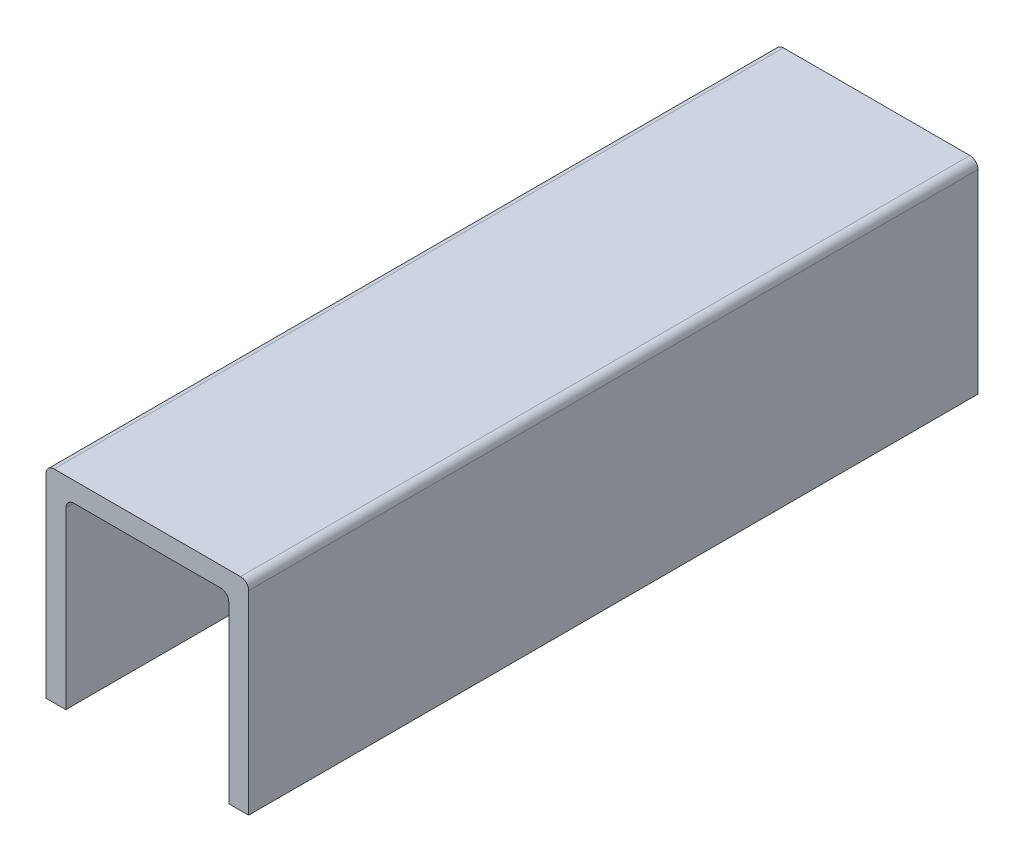
ISO-10303-21;
HEADER;
FILE_DESCRIPTION(('STEP AP214'),'2;1');
FILE_NAME('part.step','',(''),(''),'','','');
FILE_SCHEMA(('AUTOMOTIVE_DESIGN { 1 0 10303 214 1 1 1 1 }'));
ENDSEC;
DATA;
#1=APPLICATION_CONTEXT('core data for automotive mechanical design processes');
#2=APPLICATION_PROTOCOL_DEFINITION('international standard','automotive_design',2000,#1);
#3=PRODUCT_CONTEXT('',#1,'mechanical');
#4=PRODUCT('Part','Part','',(#3));
#5=PRODUCT_RELATED_PRODUCT_CATEGORY('part','',(#4));
#6=PRODUCT_DEFINITION_FORMATION('','',#4);
#7=PRODUCT_DEFINITION_CONTEXT('part definition',#1,'design');
#8=PRODUCT_DEFINITION('design','',#6,#7);
#9=PRODUCT_DEFINITION_SHAPE('','',#8);
#10=(LENGTH_UNIT() NAMED_UNIT(*) SI_UNIT(.MILLI.,.METRE.));
#11=(NAMED_UNIT(*) PLANE_ANGLE_UNIT() SI_UNIT($,.RADIAN.));
#12=(NAMED_UNIT(*) SI_UNIT($,.STERADIAN.) SOLID_ANGLE_UNIT());
#13=UNCERTAINTY_MEASURE_WITH_UNIT(LENGTH_MEASURE(1.E-05),#10,'distance_accuracy_value','');
#14=(GEOMETRIC_REPRESENTATION_CONTEXT(3) GLOBAL_UNCERTAINTY_ASSIGNED_CONTEXT((#13)) GLOBAL_UNIT_ASSIGNED_CONTEXT((#10,
#11,#12)) REPRESENTATION_CONTEXT('',''));
#15=CARTESIAN_POINT('',(0.,0.,0.));
#16=DIRECTION('',(0.,0.,1.));
#17=DIRECTION('',(1.,0.,0.));
#18=AXIS2_PLACEMENT_3D('',#15,#16,#17);
#19=CARTESIAN_POINT('',(4.887,0.,180.));
#20=DIRECTION('',(0.,1.,0.));
#21=DIRECTION('',(-1.,0.,0.));
#22=AXIS2_PLACEMENT_3D('',#19,#20,#21);
#23=PLANE('',#22);
#24=DIRECTION('',(1.,0.,0.));
#25=VECTOR('',#24,1.);
#26=CARTESIAN_POINT('',(4.887,0.,0.));
#27=LINE('',#26,#25);
#28=CARTESIAN_POINT('',(0.,0.,0.));
#29=VERTEX_POINT('',#28);
#30=CARTESIAN_POINT('',(4.887,0.,0.));
#31=VERTEX_POINT('',#30);
#32=EDGE_CURVE('E152',#29,#31,#27,.T.);
#33=ORIENTED_EDGE('',*,*,#32,.T.);
#34=DIRECTION('',(0.,0.,-1.));
#35=VECTOR('',#34,1.);
#36=CARTESIAN_POINT('',(4.887,0.,180.));
#37=LINE('',#36,#35);
#38=CARTESIAN_POINT('',(4.887,0.,180.));
#39=VERTEX_POINT('',#38);
#40=EDGE_CURVE('E133',#39,#31,#37,.T.);
#41=ORIENTED_EDGE('',*,*,#40,.F.);
#42=DIRECTION('',(1.,0.,0.));
#43=VECTOR('',#42,1.);
#44=CARTESIAN_POINT('',(4.887,0.,180.));
#45=LINE('',#44,#43);
#46=CARTESIAN_POINT('',(0.,0.,180.));
#47=VERTEX_POINT('',#46);
#48=EDGE_CURVE('E139',#47,#39,#45,.T.);
#49=ORIENTED_EDGE('',*,*,#48,.F.);
#50=DIRECTION('',(0.,0.,-1.));
#51=VECTOR('',#50,1.);
#52=CARTESIAN_POINT('',(0.,0.,180.));
#53=LINE('',#52,#51);
#54=EDGE_CURVE('E222',#47,#29,#53,.T.);
#55=ORIENTED_EDGE('',*,*,#54,.T.);
#56=EDGE_LOOP('',(#33,#41,#49,#55));
#57=FACE_BOUND('',#56,.T.);
#58=ADVANCED_FACE('F38',(#57),#23,.F.);
#59=CARTESIAN_POINT('',(4.887,45.113,180.));
#60=DIRECTION('',(-1.,0.,0.));
#61=DIRECTION('',(0.,-1.,0.));
#62=AXIS2_PLACEMENT_3D('',#59,#60,#61);
#63=PLANE('',#62);
#64=DIRECTION('',(0.,1.,0.));
#65=VECTOR('',#64,1.);
#66=CARTESIAN_POINT('',(4.887,45.113,0.));
#67=LINE('',#66,#65);
#68=CARTESIAN_POINT('',(4.887,43.113,0.));
#69=VERTEX_POINT('',#68);
#70=EDGE_CURVE('E205',#31,#69,#67,.T.);
#71=ORIENTED_EDGE('',*,*,#70,.T.);
#72=DIRECTION('',(0.,0.,-1.));
#73=VECTOR('',#72,1.);
#74=CARTESIAN_POINT('',(4.887,43.113,180.));
#75=LINE('',#74,#73);
#76=CARTESIAN_POINT('',(4.887,43.113,180.));
#77=VERTEX_POINT('',#76);
#78=EDGE_CURVE('E136',#69,#77,#75,.F.);
#79=ORIENTED_EDGE('',*,*,#78,.T.);
#80=DIRECTION('',(0.,1.,0.));
#81=VECTOR('',#80,1.);
#82=CARTESIAN_POINT('',(4.887,45.113,180.));
#83=LINE('',#82,#81);
#84=EDGE_CURVE('E128',#39,#77,#83,.T.);
#85=ORIENTED_EDGE('',*,*,#84,.F.);
#86=ORIENTED_EDGE('',*,*,#40,.T.);
#87=EDGE_LOOP('',(#71,#79,#85,#86));
#88=FACE_BOUND('',#87,.T.);
#89=ADVANCED_FACE('F131',(#88),#63,.F.);
#90=CARTESIAN_POINT('',(45.113,45.113,180.));
#91=DIRECTION('',(0.,1.,0.));
#92=DIRECTION('',(-1.,0.,0.));
#93=AXIS2_PLACEMENT_3D('',#90,#91,#92);
#94=PLANE('',#93);
#95=DIRECTION('',(1.,0.,0.));
#96=VECTOR('',#95,1.);
#97=CARTESIAN_POINT('',(45.113,45.113,180.));
#98=LINE('',#97,#96);
#99=CARTESIAN_POINT('',(6.88700000000002,45.113,180.));
#100=VERTEX_POINT('',#99);
#101=CARTESIAN_POINT('',(43.113,45.113,180.));
#102=VERTEX_POINT('',#101);
#103=EDGE_CURVE('E138',#100,#102,#98,.T.);
#104=ORIENTED_EDGE('',*,*,#103,.F.);
#105=DIRECTION('',(0.,0.,-1.));
#106=VECTOR('',#105,1.);
#107=CARTESIAN_POINT('',(6.887,45.113,0.));
#108=LINE('',#107,#106);
#109=CARTESIAN_POINT('',(6.88700000000002,45.113,0.));
#110=VERTEX_POINT('',#109);
#111=EDGE_CURVE('E179',#100,#110,#108,.T.);
#112=ORIENTED_EDGE('',*,*,#111,.T.);
#113=DIRECTION('',(1.,0.,0.));
#114=VECTOR('',#113,1.);
#115=CARTESIAN_POINT('',(45.113,45.113,0.));
#116=LINE('',#115,#114);
#117=CARTESIAN_POINT('',(43.113,45.113,0.));
#118=VERTEX_POINT('',#117);
#119=EDGE_CURVE('E195',#110,#118,#116,.T.);
#120=ORIENTED_EDGE('',*,*,#119,.T.);
#121=DIRECTION('',(0.,0.,-1.));
#122=VECTOR('',#121,1.);
#123=CARTESIAN_POINT('',(43.113,45.113,180.));
#124=LINE('',#123,#122);
#125=EDGE_CURVE('E177',#118,#102,#124,.F.);
#126=ORIENTED_EDGE('',*,*,#125,.T.);
#127=EDGE_LOOP('',(#104,#112,#120,#126));
#128=FACE_BOUND('',#127,.T.);
#129=ADVANCED_FACE('F203',(#128),#94,.F.);
#130=CARTESIAN_POINT('',(45.113,0.,180.));
#131=DIRECTION('',(1.,0.,0.));
#132=DIRECTION('',(0.,0.,-1.));
#133=AXIS2_PLACEMENT_3D('',#130,#131,#132);
#134=PLANE('',#133);
#135=DIRECTION('',(0.,-1.,0.));
#136=VECTOR('',#135,1.);
#137=CARTESIAN_POINT('',(45.113,0.,180.));
#138=LINE('',#137,#136);
#139=CARTESIAN_POINT('',(45.113,43.113,180.));
#140=VERTEX_POINT('',#139);
#141=CARTESIAN_POINT('',(45.113,0.,180.));
#142=VERTEX_POINT('',#141);
#143=EDGE_CURVE('E210',#140,#142,#138,.T.);
#144=ORIENTED_EDGE('',*,*,#143,.F.);
#145=DIRECTION('',(0.,0.,-1.));
#146=VECTOR('',#145,1.);
#147=CARTESIAN_POINT('',(45.113,43.113,0.));
#148=LINE('',#147,#146);
#149=CARTESIAN_POINT('',(45.113,43.113,0.));
#150=VERTEX_POINT('',#149);
#151=EDGE_CURVE('E183',#140,#150,#148,.T.);
#152=ORIENTED_EDGE('',*,*,#151,.T.);
#153=DIRECTION('',(0.,-1.,0.));
#154=VECTOR('',#153,1.);
#155=CARTESIAN_POINT('',(45.113,0.,0.));
#156=LINE('',#155,#154);
#157=CARTESIAN_POINT('',(45.113,0.,0.));
#158=VERTEX_POINT('',#157);
#159=EDGE_CURVE('E197',#150,#158,#156,.T.);
#160=ORIENTED_EDGE('',*,*,#159,.T.);
#161=DIRECTION('',(0.,0.,-1.));
#162=VECTOR('',#161,1.);
#163=CARTESIAN_POINT('',(45.113,0.,180.));
#164=LINE('',#163,#162);
#165=EDGE_CURVE('E154',#142,#158,#164,.T.);
#166=ORIENTED_EDGE('',*,*,#165,.F.);
#167=EDGE_LOOP('',(#144,#152,#160,#166));
#168=FACE_BOUND('',#167,.T.);
#169=ADVANCED_FACE('F208',(#168),#134,.F.);
#170=CARTESIAN_POINT('',(50.,0.,180.));
#171=DIRECTION('',(0.,1.,0.));
#172=DIRECTION('',(-1.,0.,0.));
#173=AXIS2_PLACEMENT_3D('',#170,#171,#172);
#174=PLANE('',#173);
#175=DIRECTION('',(1.,0.,0.));
#176=VECTOR('',#175,1.);
#177=CARTESIAN_POINT('',(50.,0.,0.));
#178=LINE('',#177,#176);
#179=CARTESIAN_POINT('',(50.,0.,0.));
#180=VERTEX_POINT('',#179);
#181=EDGE_CURVE('E226',#158,#180,#178,.T.);
#182=ORIENTED_EDGE('',*,*,#181,.T.);
#183=DIRECTION('',(0.,0.,-1.));
#184=VECTOR('',#183,1.);
#185=CARTESIAN_POINT('',(50.,0.,180.));
#186=LINE('',#185,#184);
#187=CARTESIAN_POINT('',(50.,0.,180.));
#188=VERTEX_POINT('',#187);
#189=EDGE_CURVE('E160',#188,#180,#186,.T.);
#190=ORIENTED_EDGE('',*,*,#189,.F.);
#191=DIRECTION('',(1.,0.,0.));
#192=VECTOR('',#191,1.);
#193=CARTESIAN_POINT('',(50.,0.,180.));
#194=LINE('',#193,#192);
#195=EDGE_CURVE('E212',#142,#188,#194,.T.);
#196=ORIENTED_EDGE('',*,*,#195,.F.);
#197=ORIENTED_EDGE('',*,*,#165,.T.);
#198=EDGE_LOOP('',(#182,#190,#196,#197));
#199=FACE_BOUND('',#198,.T.);
#200=ADVANCED_FACE('F286',(#199),#174,.F.);
#201=CARTESIAN_POINT('',(50.,50.,180.));
#202=DIRECTION('',(-1.,0.,0.));
#203=DIRECTION('',(0.,0.,1.));
#204=AXIS2_PLACEMENT_3D('',#201,#202,#203);
#205=PLANE('',#204);
#206=DIRECTION('',(0.,1.,0.));
#207=VECTOR('',#206,1.);
#208=CARTESIAN_POINT('',(50.,50.,0.));
#209=LINE('',#208,#207);
#210=CARTESIAN_POINT('',(50.,48.,0.));
#211=VERTEX_POINT('',#210);
#212=EDGE_CURVE('E228',#180,#211,#209,.T.);
#213=ORIENTED_EDGE('',*,*,#212,.T.);
#214=DIRECTION('',(0.,0.,-1.));
#215=VECTOR('',#214,1.);
#216=CARTESIAN_POINT('',(50.,48.,180.));
#217=LINE('',#216,#215);
#218=CARTESIAN_POINT('',(50.,48.,180.));
#219=VERTEX_POINT('',#218);
#220=EDGE_CURVE('E53',#211,#219,#217,.F.);
#221=ORIENTED_EDGE('',*,*,#220,.T.);
#222=DIRECTION('',(0.,1.,0.));
#223=VECTOR('',#222,1.);
#224=CARTESIAN_POINT('',(50.,50.,180.));
#225=LINE('',#224,#223);
#226=EDGE_CURVE('E214',#188,#219,#225,.T.);
#227=ORIENTED_EDGE('',*,*,#226,.F.);
#228=ORIENTED_EDGE('',*,*,#189,.T.);
#229=EDGE_LOOP('',(#213,#221,#227,#228));
#230=FACE_BOUND('',#229,.T.);
#231=ADVANCED_FACE('F237',(#230),#205,.F.);
#232=CARTESIAN_POINT('',(0.,50.,180.));
#233=DIRECTION('',(0.,-1.,0.));
#234=DIRECTION('',(0.,0.,-1.));
#235=AXIS2_PLACEMENT_3D('',#232,#233,#234);
#236=PLANE('',#235);
#237=DIRECTION('',(-1.,0.,0.));
#238=VECTOR('',#237,1.);
#239=CARTESIAN_POINT('',(0.,50.,0.));
#240=LINE('',#239,#238);
#241=CARTESIAN_POINT('',(48.,50.,0.));
#242=VERTEX_POINT('',#241);
#243=CARTESIAN_POINT('',(2.,50.,0.));
#244=VERTEX_POINT('',#243);
#245=EDGE_CURVE('E230',#242,#244,#240,.T.);
#246=ORIENTED_EDGE('',*,*,#245,.T.);
#247=DIRECTION('',(0.,0.,-1.));
#248=VECTOR('',#247,1.);
#249=CARTESIAN_POINT('',(2.,50.,180.));
#250=LINE('',#249,#248);
#251=CARTESIAN_POINT('',(2.,50.,180.));
#252=VERTEX_POINT('',#251);
#253=EDGE_CURVE('E170',#244,#252,#250,.F.);
#254=ORIENTED_EDGE('',*,*,#253,.T.);
#255=DIRECTION('',(-1.,0.,0.));
#256=VECTOR('',#255,1.);
#257=CARTESIAN_POINT('',(0.,50.,180.));
#258=LINE('',#257,#256);
#259=CARTESIAN_POINT('',(48.,50.,180.));
#260=VERTEX_POINT('',#259);
#261=EDGE_CURVE('E219',#260,#252,#258,.T.);
#262=ORIENTED_EDGE('',*,*,#261,.F.);
#263=DIRECTION('',(0.,0.,-1.));
#264=VECTOR('',#263,1.);
#265=CARTESIAN_POINT('',(48.,50.,180.));
#266=LINE('',#265,#264);
#267=EDGE_CURVE('E167',#260,#242,#266,.T.);
#268=ORIENTED_EDGE('',*,*,#267,.T.);
#269=EDGE_LOOP('',(#246,#254,#262,#268));
#270=FACE_BOUND('',#269,.T.);
#271=ADVANCED_FACE('F246',(#270),#236,.F.);
#272=CARTESIAN_POINT('',(0.,0.,180.));
#273=DIRECTION('',(1.,0.,0.));
#274=DIRECTION('',(0.,0.,-1.));
#275=AXIS2_PLACEMENT_3D('',#272,#273,#274);
#276=PLANE('',#275);
#277=DIRECTION('',(0.,-1.,0.));
#278=VECTOR('',#277,1.);
#279=CARTESIAN_POINT('',(0.,0.,180.));
#280=LINE('',#279,#278);
#281=CARTESIAN_POINT('',(0.,48.,180.));
#282=VERTEX_POINT('',#281);
#283=EDGE_CURVE('E145',#282,#47,#280,.T.);
#284=ORIENTED_EDGE('',*,*,#283,.F.);
#285=DIRECTION('',(0.,0.,-1.));
#286=VECTOR('',#285,1.);
#287=CARTESIAN_POINT('',(0.,48.,180.));
#288=LINE('',#287,#286);
#289=CARTESIAN_POINT('',(0.,48.,0.));
#290=VERTEX_POINT('',#289);
#291=EDGE_CURVE('E153',#282,#290,#288,.T.);
#292=ORIENTED_EDGE('',*,*,#291,.T.);
#293=DIRECTION('',(0.,-1.,0.));
#294=VECTOR('',#293,1.);
#295=CARTESIAN_POINT('',(0.,0.,0.));
#296=LINE('',#295,#294);
#297=EDGE_CURVE('E149',#290,#29,#296,.T.);
#298=ORIENTED_EDGE('',*,*,#297,.T.);
#299=ORIENTED_EDGE('',*,*,#54,.F.);
#300=EDGE_LOOP('',(#284,#292,#298,#299));
#301=FACE_BOUND('',#300,.T.);
#302=ADVANCED_FACE('F253',(#301),#276,.F.);
#303=CARTESIAN_POINT('',(0.,0.,180.));
#304=DIRECTION('',(0.,0.,-1.));
#305=DIRECTION('',(-1.,0.,0.));
#306=AXIS2_PLACEMENT_3D('',#303,#304,#305);
#307=PLANE('',#306);
#308=ORIENTED_EDGE('',*,*,#261,.T.);
#309=CARTESIAN_POINT('',(2.,48.,180.));
#310=DIRECTION('',(0.,0.,-1.));
#311=DIRECTION('',(-1.,0.,0.));
#312=AXIS2_PLACEMENT_3D('',#309,#310,#311);
#313=CIRCLE('',#312,2.);
#314=EDGE_CURVE('E174',#252,#282,#313,.F.);
#315=ORIENTED_EDGE('',*,*,#314,.T.);
#316=ORIENTED_EDGE('',*,*,#283,.T.);
#317=ORIENTED_EDGE('',*,*,#48,.T.);
#318=ORIENTED_EDGE('',*,*,#84,.T.);
#319=CARTESIAN_POINT('',(6.887,43.113,180.));
#320=DIRECTION('',(0.,0.,-1.));
#321=DIRECTION('',(-1.,0.,0.));
#322=AXIS2_PLACEMENT_3D('',#319,#320,#321);
#323=CIRCLE('',#322,2.);
#324=EDGE_CURVE('E188',#77,#100,#323,.T.);
#325=ORIENTED_EDGE('',*,*,#324,.T.);
#326=ORIENTED_EDGE('',*,*,#103,.T.);
#327=CARTESIAN_POINT('',(43.113,43.113,180.));
#328=DIRECTION('',(0.,0.,-1.));
#329=DIRECTION('',(-1.,0.,0.));
#330=AXIS2_PLACEMENT_3D('',#327,#328,#329);
#331=CIRCLE('',#330,2.);
#332=EDGE_CURVE('E11',#102,#140,#331,.T.);
#333=ORIENTED_EDGE('',*,*,#332,.T.);
#334=ORIENTED_EDGE('',*,*,#143,.T.);
#335=ORIENTED_EDGE('',*,*,#195,.T.);
#336=ORIENTED_EDGE('',*,*,#226,.T.);
#337=CARTESIAN_POINT('',(48.,48.,180.));
#338=DIRECTION('',(0.,0.,-1.));
#339=DIRECTION('',(-1.,0.,0.));
#340=AXIS2_PLACEMENT_3D('',#337,#338,#339);
#341=CIRCLE('',#340,2.);
#342=EDGE_CURVE('E172',#219,#260,#341,.F.);
#343=ORIENTED_EDGE('',*,*,#342,.T.);
#344=EDGE_LOOP('',(#308,#315,#316,#317,#318,#325,#326,#333,#334,#335,#336,#343));
#345=FACE_BOUND('',#344,.T.);
#346=ADVANCED_FACE('F143',(#345),#307,.F.);
#347=CARTESIAN_POINT('',(0.,0.,0.));
#348=DIRECTION('',(0.,0.,-1.));
#349=DIRECTION('',(-1.,0.,0.));
#350=AXIS2_PLACEMENT_3D('',#347,#348,#349);
#351=PLANE('',#350);
#352=ORIENTED_EDGE('',*,*,#297,.F.);
#353=CARTESIAN_POINT('',(2.,48.,0.));
#354=DIRECTION('',(0.,0.,-1.));
#355=DIRECTION('',(-1.,0.,0.));
#356=AXIS2_PLACEMENT_3D('',#353,#354,#355);
#357=CIRCLE('',#356,2.);
#358=EDGE_CURVE('E165',#290,#244,#357,.T.);
#359=ORIENTED_EDGE('',*,*,#358,.T.);
#360=ORIENTED_EDGE('',*,*,#245,.F.);
#361=CARTESIAN_POINT('',(48.,48.,0.));
#362=DIRECTION('',(0.,0.,-1.));
#363=DIRECTION('',(-1.,0.,0.));
#364=AXIS2_PLACEMENT_3D('',#361,#362,#363);
#365=CIRCLE('',#364,2.);
#366=EDGE_CURVE('E157',#242,#211,#365,.T.);
#367=ORIENTED_EDGE('',*,*,#366,.T.);
#368=ORIENTED_EDGE('',*,*,#212,.F.);
#369=ORIENTED_EDGE('',*,*,#181,.F.);
#370=ORIENTED_EDGE('',*,*,#159,.F.);
#371=CARTESIAN_POINT('',(43.113,43.113,0.));
#372=DIRECTION('',(0.,0.,-1.));
#373=DIRECTION('',(-1.,0.,0.));
#374=AXIS2_PLACEMENT_3D('',#371,#372,#373);
#375=CIRCLE('',#374,2.);
#376=EDGE_CURVE('E46',#150,#118,#375,.F.);
#377=ORIENTED_EDGE('',*,*,#376,.T.);
#378=ORIENTED_EDGE('',*,*,#119,.F.);
#379=CARTESIAN_POINT('',(6.887,43.113,0.));
#380=DIRECTION('',(0.,0.,-1.));
#381=DIRECTION('',(-1.,0.,0.));
#382=AXIS2_PLACEMENT_3D('',#379,#380,#381);
#383=CIRCLE('',#382,2.);
#384=EDGE_CURVE('E186',#110,#69,#383,.F.);
#385=ORIENTED_EDGE('',*,*,#384,.T.);
#386=ORIENTED_EDGE('',*,*,#70,.F.);
#387=ORIENTED_EDGE('',*,*,#32,.F.);
#388=EDGE_LOOP('',(#352,#359,#360,#367,#368,#369,#370,#377,#378,#385,#386,#387));
#389=FACE_BOUND('',#388,.T.);
#390=ADVANCED_FACE('F194',(#389),#351,.T.);
#391=CARTESIAN_POINT('',(2.,48.,180.));
#392=DIRECTION('',(0.,0.,-1.));
#393=DIRECTION('',(-1.,0.,0.));
#394=AXIS2_PLACEMENT_3D('',#391,#392,#393);
#395=CYLINDRICAL_SURFACE('',#394,2.);
#396=ORIENTED_EDGE('',*,*,#314,.F.);
#397=ORIENTED_EDGE('',*,*,#253,.F.);
#398=ORIENTED_EDGE('',*,*,#358,.F.);
#399=ORIENTED_EDGE('',*,*,#291,.F.);
#400=EDGE_LOOP('',(#396,#397,#398,#399));
#401=FACE_BOUND('',#400,.T.);
#402=ADVANCED_FACE('F251',(#401),#395,.T.);
#403=CARTESIAN_POINT('',(48.,48.,180.));
#404=DIRECTION('',(0.,0.,-1.));
#405=DIRECTION('',(-1.,0.,0.));
#406=AXIS2_PLACEMENT_3D('',#403,#404,#405);
#407=CYLINDRICAL_SURFACE('',#406,2.);
#408=ORIENTED_EDGE('',*,*,#342,.F.);
#409=ORIENTED_EDGE('',*,*,#220,.F.);
#410=ORIENTED_EDGE('',*,*,#366,.F.);
#411=ORIENTED_EDGE('',*,*,#267,.F.);
#412=EDGE_LOOP('',(#408,#409,#410,#411));
#413=FACE_BOUND('',#412,.T.);
#414=ADVANCED_FACE('F243',(#413),#407,.T.);
#415=CARTESIAN_POINT('',(6.887,43.113,180.));
#416=DIRECTION('',(0.,0.,1.));
#417=DIRECTION('',(1.,0.,0.));
#418=AXIS2_PLACEMENT_3D('',#415,#416,#417);
#419=CYLINDRICAL_SURFACE('',#418,2.);
#420=ORIENTED_EDGE('',*,*,#324,.F.);
#421=ORIENTED_EDGE('',*,*,#78,.F.);
#422=ORIENTED_EDGE('',*,*,#384,.F.);
#423=ORIENTED_EDGE('',*,*,#111,.F.);
#424=EDGE_LOOP('',(#420,#421,#422,#423));
#425=FACE_BOUND('',#424,.T.);
#426=ADVANCED_FACE('F255',(#425),#419,.F.);
#427=CARTESIAN_POINT('',(43.113,43.113,180.));
#428=DIRECTION('',(0.,0.,1.));
#429=DIRECTION('',(1.,0.,0.));
#430=AXIS2_PLACEMENT_3D('',#427,#428,#429);
#431=CYLINDRICAL_SURFACE('',#430,2.);
#432=ORIENTED_EDGE('',*,*,#332,.F.);
#433=ORIENTED_EDGE('',*,*,#125,.F.);
#434=ORIENTED_EDGE('',*,*,#376,.F.);
#435=ORIENTED_EDGE('',*,*,#151,.F.);
#436=EDGE_LOOP('',(#432,#433,#434,#435));
#437=FACE_BOUND('',#436,.T.);
#438=ADVANCED_FACE('F40',(#437),#431,.F.);
#439=CLOSED_SHELL('',(#58,#89,#129,#169,#200,#231,#271,#302,#346,#390,#402,#414,#426,#438));
#440=MANIFOLD_SOLID_BREP('B2',#439);
#441=ADVANCED_BREP_SHAPE_REPRESENTATION('',(#18,#440),#14);
#442=SHAPE_DEFINITION_REPRESENTATION(#9,#441);
ENDSEC;
END-ISO-10303-21;
